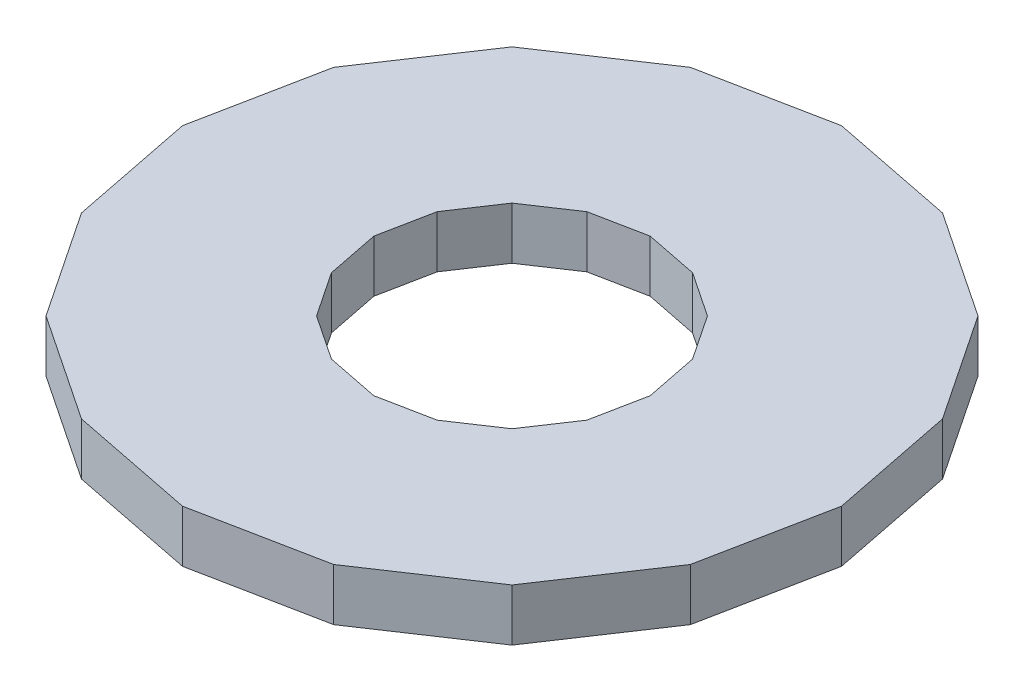
ISO-10303-21;
HEADER;
FILE_DESCRIPTION(('STEP AP214'),'2;1');
FILE_NAME('part.step','',(''),(''),'','','');
FILE_SCHEMA(('AUTOMOTIVE_DESIGN { 1 0 10303 214 1 1 1 1 }'));
ENDSEC;
DATA;
#1=APPLICATION_CONTEXT('core data for automotive mechanical design processes');
#2=APPLICATION_PROTOCOL_DEFINITION('international standard','automotive_design',2000,#1);
#3=PRODUCT_CONTEXT('',#1,'mechanical');
#4=PRODUCT('Part','Part','',(#3));
#5=PRODUCT_RELATED_PRODUCT_CATEGORY('part','',(#4));
#6=PRODUCT_DEFINITION_FORMATION('','',#4);
#7=PRODUCT_DEFINITION_CONTEXT('part definition',#1,'design');
#8=PRODUCT_DEFINITION('design','',#6,#7);
#9=PRODUCT_DEFINITION_SHAPE('','',#8);
#10=(LENGTH_UNIT() NAMED_UNIT(*) SI_UNIT(.MILLI.,.METRE.));
#11=(NAMED_UNIT(*) PLANE_ANGLE_UNIT() SI_UNIT($,.RADIAN.));
#12=(NAMED_UNIT(*) SI_UNIT($,.STERADIAN.) SOLID_ANGLE_UNIT());
#13=UNCERTAINTY_MEASURE_WITH_UNIT(LENGTH_MEASURE(1.E-05),#10,'distance_accuracy_value','');
#14=(GEOMETRIC_REPRESENTATION_CONTEXT(3) GLOBAL_UNCERTAINTY_ASSIGNED_CONTEXT((#13)) GLOBAL_UNIT_ASSIGNED_CONTEXT((#10,
#11,#12)) REPRESENTATION_CONTEXT('',''));
#15=CARTESIAN_POINT('',(0.,0.,0.));
#16=DIRECTION('',(0.,0.,1.));
#17=DIRECTION('',(1.,0.,0.));
#18=AXIS2_PLACEMENT_3D('',#15,#16,#17);
#19=CARTESIAN_POINT('',(0.,19.05,0.));
#20=DIRECTION('',(0.,1.,0.));
#21=DIRECTION('',(0.,0.,1.));
#22=AXIS2_PLACEMENT_3D('',#19,#20,#21);
#23=PLANE('',#22);
#24=DIRECTION('',(0.195090322016117,0.,-0.980785280403233));
#25=VECTOR('',#24,1.);
#26=CARTESIAN_POINT('',(111.264102657836,19.05,46.0871003261466));
#27=LINE('',#26,#25);
#28=CARTESIAN_POINT('',(111.264102657836,19.05,46.0871003261466));
#29=VERTEX_POINT('',#28);
#30=CARTESIAN_POINT('',(120.431396889373,19.05,-1.34614549599888E-12));
#31=VERTEX_POINT('',#30);
#32=EDGE_CURVE('E385',#29,#31,#27,.T.);
#33=ORIENTED_EDGE('',*,*,#32,.T.);
#34=DIRECTION('',(-0.195090322016139,0.,-0.980785280403228));
#35=VECTOR('',#34,1.);
#36=CARTESIAN_POINT('',(120.431396889373,19.05,-1.34614549599888E-12));
#37=LINE('',#36,#35);
#38=CARTESIAN_POINT('',(111.264102657835,19.05,-46.0871003261491));
#39=VERTEX_POINT('',#38);
#40=EDGE_CURVE('E389',#31,#39,#37,.T.);
#41=ORIENTED_EDGE('',*,*,#40,.T.);
#42=DIRECTION('',(-0.555570233019612,0.,-0.831469612302539));
#43=VECTOR('',#42,1.);
#44=CARTESIAN_POINT('',(111.264102657835,19.05,-46.0871003261491));
#45=LINE('',#44,#43);
#46=CARTESIAN_POINT('',(85.1578574082435,19.05,-85.1578574082453));
#47=VERTEX_POINT('',#46);
#48=EDGE_CURVE('E393',#39,#47,#45,.T.);
#49=ORIENTED_EDGE('',*,*,#48,.T.);
#50=DIRECTION('',(-0.831469612302551,0.,-0.555570233019593));
#51=VECTOR('',#50,1.);
#52=CARTESIAN_POINT('',(85.1578574082435,19.05,-85.1578574082453));
#53=LINE('',#52,#51);
#54=CARTESIAN_POINT('',(46.0871003261468,19.05,-111.264102657836));
#55=VERTEX_POINT('',#54);
#56=EDGE_CURVE('E395',#47,#55,#53,.T.);
#57=ORIENTED_EDGE('',*,*,#56,.T.);
#58=DIRECTION('',(-0.980785280403233,0.,-0.195090322016117));
#59=VECTOR('',#58,1.);
#60=CARTESIAN_POINT('',(46.0871003261468,19.05,-111.264102657836));
#61=LINE('',#60,#59);
#62=CARTESIAN_POINT('',(-1.4224713131917E-12,19.05,-120.431396889373));
#63=VERTEX_POINT('',#62);
#64=EDGE_CURVE('E398',#55,#63,#61,.T.);
#65=ORIENTED_EDGE('',*,*,#64,.T.);
#66=DIRECTION('',(-0.980785280403228,0.,0.195090322016139));
#67=VECTOR('',#66,1.);
#68=CARTESIAN_POINT('',(-1.4224713131917E-12,19.05,-120.431396889373));
#69=LINE('',#68,#67);
#70=CARTESIAN_POINT('',(-46.087100326149,19.05,-111.264102657835));
#71=VERTEX_POINT('',#70);
#72=EDGE_CURVE('E400',#63,#71,#69,.T.);
#73=ORIENTED_EDGE('',*,*,#72,.T.);
#74=DIRECTION('',(-0.831469612302539,0.,0.555570233019612));
#75=VECTOR('',#74,1.);
#76=CARTESIAN_POINT('',(-46.087100326149,19.05,-111.264102657835));
#77=LINE('',#76,#75);
#78=CARTESIAN_POINT('',(-85.1578574082452,19.05,-85.1578574082433));
#79=VERTEX_POINT('',#78);
#80=EDGE_CURVE('E402',#71,#79,#77,.T.);
#81=ORIENTED_EDGE('',*,*,#80,.T.);
#82=DIRECTION('',(-0.555570233019593,0.,0.831469612302551));
#83=VECTOR('',#82,1.);
#84=CARTESIAN_POINT('',(-85.1578574082452,19.05,-85.1578574082433));
#85=LINE('',#84,#83);
#86=CARTESIAN_POINT('',(-111.264102657836,19.05,-46.0871003261465));
#87=VERTEX_POINT('',#86);
#88=EDGE_CURVE('E404',#79,#87,#85,.T.);
#89=ORIENTED_EDGE('',*,*,#88,.T.);
#90=DIRECTION('',(-0.195090322016117,0.,0.980785280403233));
#91=VECTOR('',#90,1.);
#92=CARTESIAN_POINT('',(-111.264102657836,19.05,-46.0871003261465));
#93=LINE('',#92,#91);
#94=CARTESIAN_POINT('',(-120.431396889373,19.05,1.36002247140415E-12));
#95=VERTEX_POINT('',#94);
#96=EDGE_CURVE('E406',#87,#95,#93,.T.);
#97=ORIENTED_EDGE('',*,*,#96,.T.);
#98=DIRECTION('',(0.195090322016139,0.,0.980785280403228));
#99=VECTOR('',#98,1.);
#100=CARTESIAN_POINT('',(-120.431396889373,19.05,1.36002247140415E-12));
#101=LINE('',#100,#99);
#102=CARTESIAN_POINT('',(-111.264102657835,19.05,46.087100326149));
#103=VERTEX_POINT('',#102);
#104=EDGE_CURVE('E409',#95,#103,#101,.T.);
#105=ORIENTED_EDGE('',*,*,#104,.T.);
#106=DIRECTION('',(0.555570233019611,0.,0.831469612302539));
#107=VECTOR('',#106,1.);
#108=CARTESIAN_POINT('',(-111.264102657835,19.05,46.087100326149));
#109=LINE('',#108,#107);
#110=CARTESIAN_POINT('',(-85.1578574082434,19.05,85.1578574082453));
#111=VERTEX_POINT('',#110);
#112=EDGE_CURVE('E411',#103,#111,#109,.T.);
#113=ORIENTED_EDGE('',*,*,#112,.T.);
#114=DIRECTION('',(0.831469612302551,0.,0.555570233019593));
#115=VECTOR('',#114,1.);
#116=CARTESIAN_POINT('',(-85.1578574082434,19.05,85.1578574082453));
#117=LINE('',#116,#115);
#118=CARTESIAN_POINT('',(-46.0871003261465,19.05,111.264102657836));
#119=VERTEX_POINT('',#118);
#120=EDGE_CURVE('E413',#111,#119,#117,.T.);
#121=ORIENTED_EDGE('',*,*,#120,.T.);
#122=DIRECTION('',(0.980785280403233,0.,0.195090322016118));
#123=VECTOR('',#122,1.);
#124=CARTESIAN_POINT('',(-46.0871003261465,19.05,111.264102657836));
#125=LINE('',#124,#123);
#126=CARTESIAN_POINT('',(1.33192594686061E-12,19.05,120.431396889373));
#127=VERTEX_POINT('',#126);
#128=EDGE_CURVE('E415',#119,#127,#125,.T.);
#129=ORIENTED_EDGE('',*,*,#128,.T.);
#130=DIRECTION('',(0.980785280403228,0.,-0.195090322016139));
#131=VECTOR('',#130,1.);
#132=CARTESIAN_POINT('',(1.33192594686061E-12,19.05,120.431396889373));
#133=LINE('',#132,#131);
#134=CARTESIAN_POINT('',(46.087100326149,19.05,111.264102657835));
#135=VERTEX_POINT('',#134);
#136=EDGE_CURVE('E417',#127,#135,#133,.T.);
#137=ORIENTED_EDGE('',*,*,#136,.T.);
#138=DIRECTION('',(0.831469612302539,0.,-0.555570233019612));
#139=VECTOR('',#138,1.);
#140=CARTESIAN_POINT('',(46.087100326149,19.05,111.264102657835));
#141=LINE('',#140,#139);
#142=CARTESIAN_POINT('',(85.1578574082453,19.05,85.1578574082434));
#143=VERTEX_POINT('',#142);
#144=EDGE_CURVE('E420',#135,#143,#141,.T.);
#145=ORIENTED_EDGE('',*,*,#144,.T.);
#146=DIRECTION('',(0.555570233019593,0.,-0.831469612302551));
#147=VECTOR('',#146,1.);
#148=CARTESIAN_POINT('',(85.1578574082453,19.05,85.1578574082434));
#149=LINE('',#148,#147);
#150=EDGE_CURVE('E422',#143,#29,#149,.T.);
#151=ORIENTED_EDGE('',*,*,#150,.T.);
#152=EDGE_LOOP('',(#33,#41,#49,#57,#65,#73,#81,#89,#97,#105,#113,#121,#129,#137,#145,#151));
#153=FACE_BOUND('',#152,.T.);
#154=DIRECTION('',(-0.195090322016139,0.,-0.980785280403228));
#155=VECTOR('',#154,1.);
#156=CARTESIAN_POINT('',(50.5078352594468,19.05,-5.82868249841986E-13));
#157=LINE('',#156,#155);
#158=CARTESIAN_POINT('',(50.5078352594468,19.05,-5.82868249841986E-13));
#159=VERTEX_POINT('',#158);
#160=CARTESIAN_POINT('',(46.6631552276546,19.05,-19.3285117584162));
#161=VERTEX_POINT('',#160);
#162=EDGE_CURVE('E252',#159,#161,#157,.T.);
#163=ORIENTED_EDGE('',*,*,#162,.F.);
#164=DIRECTION('',(0.195090322016117,0.,-0.980785280403233));
#165=VECTOR('',#164,1.);
#166=CARTESIAN_POINT('',(46.663155227655,19.05,19.3285117584151));
#167=LINE('',#166,#165);
#168=CARTESIAN_POINT('',(46.663155227655,19.05,19.3285117584151));
#169=VERTEX_POINT('',#168);
#170=EDGE_CURVE('E243',#169,#159,#167,.T.);
#171=ORIENTED_EDGE('',*,*,#170,.F.);
#172=DIRECTION('',(0.555570233019593,0.,-0.831469612302552));
#173=VECTOR('',#172,1.);
#174=CARTESIAN_POINT('',(35.7144328150083,19.05,35.7144328150075));
#175=LINE('',#174,#173);
#176=CARTESIAN_POINT('',(35.7144328150083,19.05,35.7144328150075));
#177=VERTEX_POINT('',#176);
#178=EDGE_CURVE('E299',#177,#169,#175,.T.);
#179=ORIENTED_EDGE('',*,*,#178,.F.);
#180=DIRECTION('',(0.831469612302539,0.,-0.555570233019612));
#181=VECTOR('',#180,1.);
#182=CARTESIAN_POINT('',(19.3285117584162,19.05,46.6631552276546));
#183=LINE('',#182,#181);
#184=CARTESIAN_POINT('',(19.3285117584162,19.05,46.6631552276546));
#185=VERTEX_POINT('',#184);
#186=EDGE_CURVE('E296',#185,#177,#183,.T.);
#187=ORIENTED_EDGE('',*,*,#186,.F.);
#188=DIRECTION('',(0.980785280403228,0.,-0.195090322016139));
#189=VECTOR('',#188,1.);
#190=CARTESIAN_POINT('',(5.32130748839017E-13,19.05,50.5078352594468));
#191=LINE('',#190,#189);
#192=CARTESIAN_POINT('',(5.32130748839017E-13,19.05,50.5078352594468));
#193=VERTEX_POINT('',#192);
#194=EDGE_CURVE('E293',#193,#185,#191,.T.);
#195=ORIENTED_EDGE('',*,*,#194,.F.);
#196=DIRECTION('',(0.980785280403233,0.,0.195090322016118));
#197=VECTOR('',#196,1.);
#198=CARTESIAN_POINT('',(-19.3285117584151,19.05,46.6631552276551));
#199=LINE('',#198,#197);
#200=CARTESIAN_POINT('',(-19.3285117584151,19.05,46.6631552276551));
#201=VERTEX_POINT('',#200);
#202=EDGE_CURVE('E291',#201,#193,#199,.T.);
#203=ORIENTED_EDGE('',*,*,#202,.F.);
#204=DIRECTION('',(0.831469612302551,0.,0.555570233019593));
#205=VECTOR('',#204,1.);
#206=CARTESIAN_POINT('',(-35.7144328150075,19.05,35.7144328150083));
#207=LINE('',#206,#205);
#208=CARTESIAN_POINT('',(-35.7144328150075,19.05,35.7144328150083));
#209=VERTEX_POINT('',#208);
#210=EDGE_CURVE('E288',#209,#201,#207,.T.);
#211=ORIENTED_EDGE('',*,*,#210,.F.);
#212=DIRECTION('',(0.555570233019611,0.,0.831469612302539));
#213=VECTOR('',#212,1.);
#214=CARTESIAN_POINT('',(-46.6631552276546,19.05,19.3285117584161));
#215=LINE('',#214,#213);
#216=CARTESIAN_POINT('',(-46.6631552276546,19.05,19.3285117584161));
#217=VERTEX_POINT('',#216);
#218=EDGE_CURVE('E286',#217,#209,#215,.T.);
#219=ORIENTED_EDGE('',*,*,#218,.F.);
#220=DIRECTION('',(0.195090322016139,0.,0.980785280403228));
#221=VECTOR('',#220,1.);
#222=CARTESIAN_POINT('',(-50.5078352594468,19.05,5.3776812480437E-13));
#223=LINE('',#222,#221);
#224=CARTESIAN_POINT('',(-50.5078352594468,19.05,5.3776812480437E-13));
#225=VERTEX_POINT('',#224);
#226=EDGE_CURVE('E283',#225,#217,#223,.T.);
#227=ORIENTED_EDGE('',*,*,#226,.F.);
#228=DIRECTION('',(-0.195090322016117,0.,0.980785280403233));
#229=VECTOR('',#228,1.);
#230=CARTESIAN_POINT('',(-46.6631552276551,19.05,-19.3285117584151));
#231=LINE('',#230,#229);
#232=CARTESIAN_POINT('',(-46.6631552276551,19.05,-19.3285117584151));
#233=VERTEX_POINT('',#232);
#234=EDGE_CURVE('E281',#233,#225,#231,.T.);
#235=ORIENTED_EDGE('',*,*,#234,.F.);
#236=DIRECTION('',(-0.555570233019593,0.,0.831469612302551));
#237=VECTOR('',#236,1.);
#238=CARTESIAN_POINT('',(-35.7144328150083,19.05,-35.7144328150074));
#239=LINE('',#238,#237);
#240=CARTESIAN_POINT('',(-35.7144328150083,19.05,-35.7144328150074));
#241=VERTEX_POINT('',#240);
#242=EDGE_CURVE('E279',#241,#233,#239,.T.);
#243=ORIENTED_EDGE('',*,*,#242,.F.);
#244=DIRECTION('',(-0.831469612302539,0.,0.555570233019612));
#245=VECTOR('',#244,1.);
#246=CARTESIAN_POINT('',(-19.3285117584161,19.05,-46.6631552276546));
#247=LINE('',#246,#245);
#248=CARTESIAN_POINT('',(-19.3285117584161,19.05,-46.6631552276546));
#249=VERTEX_POINT('',#248);
#250=EDGE_CURVE('E276',#249,#241,#247,.T.);
#251=ORIENTED_EDGE('',*,*,#250,.F.);
#252=DIRECTION('',(-0.980785280403228,0.,0.195090322016139));
#253=VECTOR('',#252,1.);
#254=CARTESIAN_POINT('',(-5.65525179981748E-13,19.05,-50.5078352594468));
#255=LINE('',#254,#253);
#256=CARTESIAN_POINT('',(-5.65525179981748E-13,19.05,-50.5078352594468));
#257=VERTEX_POINT('',#256);
#258=EDGE_CURVE('E274',#257,#249,#255,.T.);
#259=ORIENTED_EDGE('',*,*,#258,.F.);
#260=DIRECTION('',(-0.980785280403233,0.,-0.195090322016117));
#261=VECTOR('',#260,1.);
#262=CARTESIAN_POINT('',(19.3285117584151,19.05,-46.663155227655));
#263=LINE('',#262,#261);
#264=CARTESIAN_POINT('',(19.3285117584151,19.05,-46.663155227655));
#265=VERTEX_POINT('',#264);
#266=EDGE_CURVE('E272',#265,#257,#263,.T.);
#267=ORIENTED_EDGE('',*,*,#266,.F.);
#268=DIRECTION('',(-0.831469612302552,0.,-0.555570233019593));
#269=VECTOR('',#268,1.);
#270=CARTESIAN_POINT('',(35.7144328150075,19.05,-35.7144328150082));
#271=LINE('',#270,#269);
#272=CARTESIAN_POINT('',(35.7144328150075,19.05,-35.7144328150082));
#273=VERTEX_POINT('',#272);
#274=EDGE_CURVE('E268',#273,#265,#271,.T.);
#275=ORIENTED_EDGE('',*,*,#274,.F.);
#276=DIRECTION('',(-0.555570233019612,0.,-0.831469612302539));
#277=VECTOR('',#276,1.);
#278=CARTESIAN_POINT('',(46.6631552276546,19.05,-19.3285117584162));
#279=LINE('',#278,#277);
#280=EDGE_CURVE('E266',#161,#273,#279,.T.);
#281=ORIENTED_EDGE('',*,*,#280,.F.);
#282=EDGE_LOOP('',(#163,#171,#179,#187,#195,#203,#211,#219,#227,#235,#243,#251,#259,#267,#275,#281));
#283=FACE_BOUND('',#282,.T.);
#284=ADVANCED_FACE('F34',(#153,#283),#23,.T.);
#285=CARTESIAN_POINT('',(0.,0.,0.));
#286=DIRECTION('',(0.,1.,0.));
#287=DIRECTION('',(0.,0.,1.));
#288=AXIS2_PLACEMENT_3D('',#285,#286,#287);
#289=PLANE('',#288);
#290=DIRECTION('',(0.195090322016117,0.,-0.980785280403233));
#291=VECTOR('',#290,1.);
#292=CARTESIAN_POINT('',(111.264102657836,0.,46.0871003261466));
#293=LINE('',#292,#291);
#294=CARTESIAN_POINT('',(111.264102657836,0.,46.0871003261466));
#295=VERTEX_POINT('',#294);
#296=CARTESIAN_POINT('',(120.431396889373,0.,-1.34614549599888E-12));
#297=VERTEX_POINT('',#296);
#298=EDGE_CURVE('E261',#295,#297,#293,.T.);
#299=ORIENTED_EDGE('',*,*,#298,.F.);
#300=DIRECTION('',(0.555570233019593,0.,-0.831469612302551));
#301=VECTOR('',#300,1.);
#302=CARTESIAN_POINT('',(85.1578574082453,0.,85.1578574082434));
#303=LINE('',#302,#301);
#304=CARTESIAN_POINT('',(85.1578574082453,0.,85.1578574082434));
#305=VERTEX_POINT('',#304);
#306=EDGE_CURVE('E390',#305,#295,#303,.T.);
#307=ORIENTED_EDGE('',*,*,#306,.F.);
#308=DIRECTION('',(0.831469612302539,0.,-0.555570233019612));
#309=VECTOR('',#308,1.);
#310=CARTESIAN_POINT('',(46.087100326149,0.,111.264102657835));
#311=LINE('',#310,#309);
#312=CARTESIAN_POINT('',(46.087100326149,0.,111.264102657835));
#313=VERTEX_POINT('',#312);
#314=EDGE_CURVE('E455',#313,#305,#311,.T.);
#315=ORIENTED_EDGE('',*,*,#314,.F.);
#316=DIRECTION('',(0.980785280403228,0.,-0.195090322016139));
#317=VECTOR('',#316,1.);
#318=CARTESIAN_POINT('',(1.33192594686061E-12,0.,120.431396889373));
#319=LINE('',#318,#317);
#320=CARTESIAN_POINT('',(1.33192594686061E-12,0.,120.431396889373));
#321=VERTEX_POINT('',#320);
#322=EDGE_CURVE('E453',#321,#313,#319,.T.);
#323=ORIENTED_EDGE('',*,*,#322,.F.);
#324=DIRECTION('',(0.980785280403233,0.,0.195090322016118));
#325=VECTOR('',#324,1.);
#326=CARTESIAN_POINT('',(-46.0871003261465,0.,111.264102657836));
#327=LINE('',#326,#325);
#328=CARTESIAN_POINT('',(-46.0871003261465,0.,111.264102657836));
#329=VERTEX_POINT('',#328);
#330=EDGE_CURVE('E451',#329,#321,#327,.T.);
#331=ORIENTED_EDGE('',*,*,#330,.F.);
#332=DIRECTION('',(0.831469612302551,0.,0.555570233019593));
#333=VECTOR('',#332,1.);
#334=CARTESIAN_POINT('',(-85.1578574082434,0.,85.1578574082453));
#335=LINE('',#334,#333);
#336=CARTESIAN_POINT('',(-85.1578574082434,0.,85.1578574082453));
#337=VERTEX_POINT('',#336);
#338=EDGE_CURVE('E449',#337,#329,#335,.T.);
#339=ORIENTED_EDGE('',*,*,#338,.F.);
#340=DIRECTION('',(0.555570233019611,0.,0.831469612302539));
#341=VECTOR('',#340,1.);
#342=CARTESIAN_POINT('',(-111.264102657835,0.,46.087100326149));
#343=LINE('',#342,#341);
#344=CARTESIAN_POINT('',(-111.264102657835,0.,46.087100326149));
#345=VERTEX_POINT('',#344);
#346=EDGE_CURVE('E447',#345,#337,#343,.T.);
#347=ORIENTED_EDGE('',*,*,#346,.F.);
#348=DIRECTION('',(0.195090322016139,0.,0.980785280403228));
#349=VECTOR('',#348,1.);
#350=CARTESIAN_POINT('',(-120.431396889373,0.,1.36002247140415E-12));
#351=LINE('',#350,#349);
#352=CARTESIAN_POINT('',(-120.431396889373,0.,1.36002247140415E-12));
#353=VERTEX_POINT('',#352);
#354=EDGE_CURVE('E445',#353,#345,#351,.T.);
#355=ORIENTED_EDGE('',*,*,#354,.F.);
#356=DIRECTION('',(-0.195090322016117,0.,0.980785280403233));
#357=VECTOR('',#356,1.);
#358=CARTESIAN_POINT('',(-111.264102657836,0.,-46.0871003261465));
#359=LINE('',#358,#357);
#360=CARTESIAN_POINT('',(-111.264102657836,0.,-46.0871003261465));
#361=VERTEX_POINT('',#360);
#362=EDGE_CURVE('E443',#361,#353,#359,.T.);
#363=ORIENTED_EDGE('',*,*,#362,.F.);
#364=DIRECTION('',(-0.555570233019593,0.,0.831469612302551));
#365=VECTOR('',#364,1.);
#366=CARTESIAN_POINT('',(-85.1578574082452,0.,-85.1578574082433));
#367=LINE('',#366,#365);
#368=CARTESIAN_POINT('',(-85.1578574082452,0.,-85.1578574082433));
#369=VERTEX_POINT('',#368);
#370=EDGE_CURVE('E441',#369,#361,#367,.T.);
#371=ORIENTED_EDGE('',*,*,#370,.F.);
#372=DIRECTION('',(-0.831469612302539,0.,0.555570233019612));
#373=VECTOR('',#372,1.);
#374=CARTESIAN_POINT('',(-46.087100326149,0.,-111.264102657835));
#375=LINE('',#374,#373);
#376=CARTESIAN_POINT('',(-46.087100326149,0.,-111.264102657835));
#377=VERTEX_POINT('',#376);
#378=EDGE_CURVE('E439',#377,#369,#375,.T.);
#379=ORIENTED_EDGE('',*,*,#378,.F.);
#380=DIRECTION('',(-0.980785280403228,0.,0.195090322016139));
#381=VECTOR('',#380,1.);
#382=CARTESIAN_POINT('',(-1.4224713131917E-12,0.,-120.431396889373));
#383=LINE('',#382,#381);
#384=CARTESIAN_POINT('',(-1.4224713131917E-12,0.,-120.431396889373));
#385=VERTEX_POINT('',#384);
#386=EDGE_CURVE('E437',#385,#377,#383,.T.);
#387=ORIENTED_EDGE('',*,*,#386,.F.);
#388=DIRECTION('',(-0.980785280403233,0.,-0.195090322016117));
#389=VECTOR('',#388,1.);
#390=CARTESIAN_POINT('',(46.0871003261468,0.,-111.264102657836));
#391=LINE('',#390,#389);
#392=CARTESIAN_POINT('',(46.0871003261468,0.,-111.264102657836));
#393=VERTEX_POINT('',#392);
#394=EDGE_CURVE('E435',#393,#385,#391,.T.);
#395=ORIENTED_EDGE('',*,*,#394,.F.);
#396=DIRECTION('',(-0.831469612302551,0.,-0.555570233019593));
#397=VECTOR('',#396,1.);
#398=CARTESIAN_POINT('',(85.1578574082435,0.,-85.1578574082453));
#399=LINE('',#398,#397);
#400=CARTESIAN_POINT('',(85.1578574082435,0.,-85.1578574082453));
#401=VERTEX_POINT('',#400);
#402=EDGE_CURVE('E433',#401,#393,#399,.T.);
#403=ORIENTED_EDGE('',*,*,#402,.F.);
#404=DIRECTION('',(-0.555570233019612,0.,-0.831469612302539));
#405=VECTOR('',#404,1.);
#406=CARTESIAN_POINT('',(111.264102657835,0.,-46.0871003261491));
#407=LINE('',#406,#405);
#408=CARTESIAN_POINT('',(111.264102657835,0.,-46.0871003261491));
#409=VERTEX_POINT('',#408);
#410=EDGE_CURVE('E431',#409,#401,#407,.T.);
#411=ORIENTED_EDGE('',*,*,#410,.F.);
#412=DIRECTION('',(-0.195090322016139,0.,-0.980785280403228));
#413=VECTOR('',#412,1.);
#414=CARTESIAN_POINT('',(120.431396889373,0.,-1.34614549599888E-12));
#415=LINE('',#414,#413);
#416=EDGE_CURVE('E428',#297,#409,#415,.T.);
#417=ORIENTED_EDGE('',*,*,#416,.F.);
#418=EDGE_LOOP('',(#299,#307,#315,#323,#331,#339,#347,#355,#363,#371,#379,#387,#395,#403,#411,#417));
#419=FACE_BOUND('',#418,.T.);
#420=DIRECTION('',(0.195090322016117,0.,-0.980785280403233));
#421=VECTOR('',#420,1.);
#422=CARTESIAN_POINT('',(46.663155227655,0.,19.3285117584151));
#423=LINE('',#422,#421);
#424=CARTESIAN_POINT('',(46.663155227655,0.,19.3285117584151));
#425=VERTEX_POINT('',#424);
#426=CARTESIAN_POINT('',(50.5078352594468,0.,-5.82868249841986E-13));
#427=VERTEX_POINT('',#426);
#428=EDGE_CURVE('E57',#425,#427,#423,.T.);
#429=ORIENTED_EDGE('',*,*,#428,.T.);
#430=DIRECTION('',(-0.195090322016139,0.,-0.980785280403228));
#431=VECTOR('',#430,1.);
#432=CARTESIAN_POINT('',(50.5078352594468,0.,-5.82868249841986E-13));
#433=LINE('',#432,#431);
#434=CARTESIAN_POINT('',(46.6631552276546,0.,-19.3285117584162));
#435=VERTEX_POINT('',#434);
#436=EDGE_CURVE('E259',#427,#435,#433,.T.);
#437=ORIENTED_EDGE('',*,*,#436,.T.);
#438=DIRECTION('',(-0.555570233019612,0.,-0.831469612302539));
#439=VECTOR('',#438,1.);
#440=CARTESIAN_POINT('',(46.6631552276546,0.,-19.3285117584162));
#441=LINE('',#440,#439);
#442=CARTESIAN_POINT('',(35.7144328150075,0.,-35.7144328150082));
#443=VERTEX_POINT('',#442);
#444=EDGE_CURVE('E304',#435,#443,#441,.T.);
#445=ORIENTED_EDGE('',*,*,#444,.T.);
#446=DIRECTION('',(-0.831469612302552,0.,-0.555570233019593));
#447=VECTOR('',#446,1.);
#448=CARTESIAN_POINT('',(35.7144328150075,0.,-35.7144328150082));
#449=LINE('',#448,#447);
#450=CARTESIAN_POINT('',(19.3285117584151,0.,-46.663155227655));
#451=VERTEX_POINT('',#450);
#452=EDGE_CURVE('E308',#443,#451,#449,.T.);
#453=ORIENTED_EDGE('',*,*,#452,.T.);
#454=DIRECTION('',(-0.980785280403233,0.,-0.195090322016117));
#455=VECTOR('',#454,1.);
#456=CARTESIAN_POINT('',(19.3285117584151,0.,-46.663155227655));
#457=LINE('',#456,#455);
#458=CARTESIAN_POINT('',(-5.65525179981748E-13,0.,-50.5078352594468));
#459=VERTEX_POINT('',#458);
#460=EDGE_CURVE('E311',#451,#459,#457,.T.);
#461=ORIENTED_EDGE('',*,*,#460,.T.);
#462=DIRECTION('',(-0.980785280403228,0.,0.195090322016139));
#463=VECTOR('',#462,1.);
#464=CARTESIAN_POINT('',(-5.65525179981748E-13,0.,-50.5078352594468));
#465=LINE('',#464,#463);
#466=CARTESIAN_POINT('',(-19.3285117584161,0.,-46.6631552276546));
#467=VERTEX_POINT('',#466);
#468=EDGE_CURVE('E314',#459,#467,#465,.T.);
#469=ORIENTED_EDGE('',*,*,#468,.T.);
#470=DIRECTION('',(-0.831469612302539,0.,0.555570233019612));
#471=VECTOR('',#470,1.);
#472=CARTESIAN_POINT('',(-19.3285117584161,0.,-46.6631552276546));
#473=LINE('',#472,#471);
#474=CARTESIAN_POINT('',(-35.7144328150083,0.,-35.7144328150074));
#475=VERTEX_POINT('',#474);
#476=EDGE_CURVE('E317',#467,#475,#473,.T.);
#477=ORIENTED_EDGE('',*,*,#476,.T.);
#478=DIRECTION('',(-0.555570233019593,0.,0.831469612302551));
#479=VECTOR('',#478,1.);
#480=CARTESIAN_POINT('',(-35.7144328150083,0.,-35.7144328150074));
#481=LINE('',#480,#479);
#482=CARTESIAN_POINT('',(-46.6631552276551,0.,-19.3285117584151));
#483=VERTEX_POINT('',#482);
#484=EDGE_CURVE('E321',#475,#483,#481,.T.);
#485=ORIENTED_EDGE('',*,*,#484,.T.);
#486=DIRECTION('',(-0.195090322016117,0.,0.980785280403233));
#487=VECTOR('',#486,1.);
#488=CARTESIAN_POINT('',(-46.6631552276551,0.,-19.3285117584151));
#489=LINE('',#488,#487);
#490=CARTESIAN_POINT('',(-50.5078352594468,0.,5.3776812480437E-13));
#491=VERTEX_POINT('',#490);
#492=EDGE_CURVE('E324',#483,#491,#489,.T.);
#493=ORIENTED_EDGE('',*,*,#492,.T.);
#494=DIRECTION('',(0.195090322016139,0.,0.980785280403228));
#495=VECTOR('',#494,1.);
#496=CARTESIAN_POINT('',(-50.5078352594468,0.,5.3776812480437E-13));
#497=LINE('',#496,#495);
#498=CARTESIAN_POINT('',(-46.6631552276546,0.,19.3285117584161));
#499=VERTEX_POINT('',#498);
#500=EDGE_CURVE('E328',#491,#499,#497,.T.);
#501=ORIENTED_EDGE('',*,*,#500,.T.);
#502=DIRECTION('',(0.555570233019611,0.,0.831469612302539));
#503=VECTOR('',#502,1.);
#504=CARTESIAN_POINT('',(-46.6631552276546,0.,19.3285117584161));
#505=LINE('',#504,#503);
#506=CARTESIAN_POINT('',(-35.7144328150075,0.,35.7144328150083));
#507=VERTEX_POINT('',#506);
#508=EDGE_CURVE('E331',#499,#507,#505,.T.);
#509=ORIENTED_EDGE('',*,*,#508,.T.);
#510=DIRECTION('',(0.831469612302551,0.,0.555570233019593));
#511=VECTOR('',#510,1.);
#512=CARTESIAN_POINT('',(-35.7144328150075,0.,35.7144328150083));
#513=LINE('',#512,#511);
#514=CARTESIAN_POINT('',(-19.3285117584151,0.,46.6631552276551));
#515=VERTEX_POINT('',#514);
#516=EDGE_CURVE('E334',#507,#515,#513,.T.);
#517=ORIENTED_EDGE('',*,*,#516,.T.);
#518=DIRECTION('',(0.980785280403233,0.,0.195090322016118));
#519=VECTOR('',#518,1.);
#520=CARTESIAN_POINT('',(-19.3285117584151,0.,46.6631552276551));
#521=LINE('',#520,#519);
#522=CARTESIAN_POINT('',(5.32130748839017E-13,0.,50.5078352594468));
#523=VERTEX_POINT('',#522);
#524=EDGE_CURVE('E338',#515,#523,#521,.T.);
#525=ORIENTED_EDGE('',*,*,#524,.T.);
#526=DIRECTION('',(0.980785280403228,0.,-0.195090322016139));
#527=VECTOR('',#526,1.);
#528=CARTESIAN_POINT('',(5.32130748839017E-13,0.,50.5078352594468));
#529=LINE('',#528,#527);
#530=CARTESIAN_POINT('',(19.3285117584162,0.,46.6631552276546));
#531=VERTEX_POINT('',#530);
#532=EDGE_CURVE('E342',#523,#531,#529,.T.);
#533=ORIENTED_EDGE('',*,*,#532,.T.);
#534=DIRECTION('',(0.831469612302539,0.,-0.555570233019612));
#535=VECTOR('',#534,1.);
#536=CARTESIAN_POINT('',(19.3285117584162,0.,46.6631552276546));
#537=LINE('',#536,#535);
#538=CARTESIAN_POINT('',(35.7144328150083,0.,35.7144328150075));
#539=VERTEX_POINT('',#538);
#540=EDGE_CURVE('E346',#531,#539,#537,.T.);
#541=ORIENTED_EDGE('',*,*,#540,.T.);
#542=DIRECTION('',(0.555570233019593,0.,-0.831469612302552));
#543=VECTOR('',#542,1.);
#544=CARTESIAN_POINT('',(35.7144328150083,0.,35.7144328150075));
#545=LINE('',#544,#543);
#546=EDGE_CURVE('E253',#539,#425,#545,.T.);
#547=ORIENTED_EDGE('',*,*,#546,.T.);
#548=EDGE_LOOP('',(#429,#437,#445,#453,#461,#469,#477,#485,#493,#501,#509,#517,#525,#533,#541,#547));
#549=FACE_BOUND('',#548,.T.);
#550=ADVANCED_FACE('F512',(#419,#549),#289,.F.);
#551=CARTESIAN_POINT('',(111.264102657836,19.05,46.0871003261466));
#552=DIRECTION('',(-0.980785280403233,0.,-0.195090322016117));
#553=DIRECTION('',(-0.195090322016117,0.,0.980785280403233));
#554=AXIS2_PLACEMENT_3D('',#551,#552,#553);
#555=PLANE('',#554);
#556=ORIENTED_EDGE('',*,*,#298,.T.);
#557=DIRECTION('',(0.,-1.,0.));
#558=VECTOR('',#557,1.);
#559=CARTESIAN_POINT('',(120.431396889373,19.05,-1.34614549599888E-12));
#560=LINE('',#559,#558);
#561=EDGE_CURVE('E11',#31,#297,#560,.T.);
#562=ORIENTED_EDGE('',*,*,#561,.F.);
#563=ORIENTED_EDGE('',*,*,#32,.F.);
#564=DIRECTION('',(0.,-1.,0.));
#565=VECTOR('',#564,1.);
#566=CARTESIAN_POINT('',(111.264102657836,19.05,46.0871003261466));
#567=LINE('',#566,#565);
#568=EDGE_CURVE('E424',#29,#295,#567,.T.);
#569=ORIENTED_EDGE('',*,*,#568,.T.);
#570=EDGE_LOOP('',(#556,#562,#563,#569));
#571=FACE_BOUND('',#570,.T.);
#572=ADVANCED_FACE('F36',(#571),#555,.F.);
#573=CARTESIAN_POINT('',(120.431396889373,19.05,-1.34614549599888E-12));
#574=DIRECTION('',(-0.980785280403228,0.,0.195090322016139));
#575=DIRECTION('',(0.195090322016139,0.,0.980785280403229));
#576=AXIS2_PLACEMENT_3D('',#573,#574,#575);
#577=PLANE('',#576);
#578=ORIENTED_EDGE('',*,*,#416,.T.);
#579=DIRECTION('',(0.,-1.,0.));
#580=VECTOR('',#579,1.);
#581=CARTESIAN_POINT('',(111.264102657835,19.05,-46.0871003261491));
#582=LINE('',#581,#580);
#583=EDGE_CURVE('E42',#39,#409,#582,.T.);
#584=ORIENTED_EDGE('',*,*,#583,.F.);
#585=ORIENTED_EDGE('',*,*,#40,.F.);
#586=ORIENTED_EDGE('',*,*,#561,.T.);
#587=EDGE_LOOP('',(#578,#584,#585,#586));
#588=FACE_BOUND('',#587,.T.);
#589=ADVANCED_FACE('F529',(#588),#577,.F.);
#590=CARTESIAN_POINT('',(111.264102657835,19.05,-46.0871003261491));
#591=DIRECTION('',(-0.831469612302539,0.,0.555570233019612));
#592=DIRECTION('',(0.555570233019612,0.,0.831469612302539));
#593=AXIS2_PLACEMENT_3D('',#590,#591,#592);
#594=PLANE('',#593);
#595=ORIENTED_EDGE('',*,*,#410,.T.);
#596=DIRECTION('',(0.,-1.,0.));
#597=VECTOR('',#596,1.);
#598=CARTESIAN_POINT('',(85.1578574082435,19.05,-85.1578574082453));
#599=LINE('',#598,#597);
#600=EDGE_CURVE('E498',#47,#401,#599,.T.);
#601=ORIENTED_EDGE('',*,*,#600,.F.);
#602=ORIENTED_EDGE('',*,*,#48,.F.);
#603=ORIENTED_EDGE('',*,*,#583,.T.);
#604=EDGE_LOOP('',(#595,#601,#602,#603));
#605=FACE_BOUND('',#604,.T.);
#606=ADVANCED_FACE('F506',(#605),#594,.F.);
#607=CARTESIAN_POINT('',(85.1578574082435,19.05,-85.1578574082453));
#608=DIRECTION('',(-0.555570233019593,0.,0.831469612302551));
#609=DIRECTION('',(0.831469612302551,0.,0.555570233019593));
#610=AXIS2_PLACEMENT_3D('',#607,#608,#609);
#611=PLANE('',#610);
#612=ORIENTED_EDGE('',*,*,#402,.T.);
#613=DIRECTION('',(0.,-1.,0.));
#614=VECTOR('',#613,1.);
#615=CARTESIAN_POINT('',(46.0871003261468,19.05,-111.264102657836));
#616=LINE('',#615,#614);
#617=EDGE_CURVE('E494',#55,#393,#616,.T.);
#618=ORIENTED_EDGE('',*,*,#617,.F.);
#619=ORIENTED_EDGE('',*,*,#56,.F.);
#620=ORIENTED_EDGE('',*,*,#600,.T.);
#621=EDGE_LOOP('',(#612,#618,#619,#620));
#622=FACE_BOUND('',#621,.T.);
#623=ADVANCED_FACE('F518',(#622),#611,.F.);
#624=CARTESIAN_POINT('',(46.0871003261468,19.05,-111.264102657836));
#625=DIRECTION('',(-0.195090322016117,0.,0.980785280403233));
#626=DIRECTION('',(0.980785280403233,0.,0.195090322016117));
#627=AXIS2_PLACEMENT_3D('',#624,#625,#626);
#628=PLANE('',#627);
#629=ORIENTED_EDGE('',*,*,#394,.T.);
#630=DIRECTION('',(0.,-1.,0.));
#631=VECTOR('',#630,1.);
#632=CARTESIAN_POINT('',(-1.4224713131917E-12,19.05,-120.431396889373));
#633=LINE('',#632,#631);
#634=EDGE_CURVE('E491',#63,#385,#633,.T.);
#635=ORIENTED_EDGE('',*,*,#634,.F.);
#636=ORIENTED_EDGE('',*,*,#64,.F.);
#637=ORIENTED_EDGE('',*,*,#617,.T.);
#638=EDGE_LOOP('',(#629,#635,#636,#637));
#639=FACE_BOUND('',#638,.T.);
#640=ADVANCED_FACE('F522',(#639),#628,.F.);
#641=CARTESIAN_POINT('',(-1.4224713131917E-12,19.05,-120.431396889373));
#642=DIRECTION('',(0.195090322016139,0.,0.980785280403228));
#643=DIRECTION('',(0.980785280403228,0.,-0.195090322016139));
#644=AXIS2_PLACEMENT_3D('',#641,#642,#643);
#645=PLANE('',#644);
#646=ORIENTED_EDGE('',*,*,#386,.T.);
#647=DIRECTION('',(0.,-1.,0.));
#648=VECTOR('',#647,1.);
#649=CARTESIAN_POINT('',(-46.087100326149,19.05,-111.264102657835));
#650=LINE('',#649,#648);
#651=EDGE_CURVE('E488',#71,#377,#650,.T.);
#652=ORIENTED_EDGE('',*,*,#651,.F.);
#653=ORIENTED_EDGE('',*,*,#72,.F.);
#654=ORIENTED_EDGE('',*,*,#634,.T.);
#655=EDGE_LOOP('',(#646,#652,#653,#654));
#656=FACE_BOUND('',#655,.T.);
#657=ADVANCED_FACE('F582',(#656),#645,.F.);
#658=CARTESIAN_POINT('',(-46.087100326149,19.05,-111.264102657835));
#659=DIRECTION('',(0.555570233019612,0.,0.831469612302539));
#660=DIRECTION('',(0.831469612302539,0.,-0.555570233019612));
#661=AXIS2_PLACEMENT_3D('',#658,#659,#660);
#662=PLANE('',#661);
#663=ORIENTED_EDGE('',*,*,#378,.T.);
#664=DIRECTION('',(0.,-1.,0.));
#665=VECTOR('',#664,1.);
#666=CARTESIAN_POINT('',(-85.1578574082452,19.05,-85.1578574082433));
#667=LINE('',#666,#665);
#668=EDGE_CURVE('E485',#79,#369,#667,.T.);
#669=ORIENTED_EDGE('',*,*,#668,.F.);
#670=ORIENTED_EDGE('',*,*,#80,.F.);
#671=ORIENTED_EDGE('',*,*,#651,.T.);
#672=EDGE_LOOP('',(#663,#669,#670,#671));
#673=FACE_BOUND('',#672,.T.);
#674=ADVANCED_FACE('F579',(#673),#662,.F.);
#675=CARTESIAN_POINT('',(-85.1578574082452,19.05,-85.1578574082433));
#676=DIRECTION('',(0.831469612302551,0.,0.555570233019593));
#677=DIRECTION('',(0.555570233019593,0.,-0.831469612302551));
#678=AXIS2_PLACEMENT_3D('',#675,#676,#677);
#679=PLANE('',#678);
#680=ORIENTED_EDGE('',*,*,#370,.T.);
#681=DIRECTION('',(0.,-1.,0.));
#682=VECTOR('',#681,1.);
#683=CARTESIAN_POINT('',(-111.264102657836,19.05,-46.0871003261465));
#684=LINE('',#683,#682);
#685=EDGE_CURVE('E482',#87,#361,#684,.T.);
#686=ORIENTED_EDGE('',*,*,#685,.F.);
#687=ORIENTED_EDGE('',*,*,#88,.F.);
#688=ORIENTED_EDGE('',*,*,#668,.T.);
#689=EDGE_LOOP('',(#680,#686,#687,#688));
#690=FACE_BOUND('',#689,.T.);
#691=ADVANCED_FACE('F575',(#690),#679,.F.);
#692=CARTESIAN_POINT('',(-111.264102657836,19.05,-46.0871003261465));
#693=DIRECTION('',(0.980785280403233,0.,0.195090322016117));
#694=DIRECTION('',(0.195090322016117,0.,-0.980785280403233));
#695=AXIS2_PLACEMENT_3D('',#692,#693,#694);
#696=PLANE('',#695);
#697=ORIENTED_EDGE('',*,*,#362,.T.);
#698=DIRECTION('',(0.,-1.,0.));
#699=VECTOR('',#698,1.);
#700=CARTESIAN_POINT('',(-120.431396889373,19.05,1.36002247140415E-12));
#701=LINE('',#700,#699);
#702=EDGE_CURVE('E479',#95,#353,#701,.T.);
#703=ORIENTED_EDGE('',*,*,#702,.F.);
#704=ORIENTED_EDGE('',*,*,#96,.F.);
#705=ORIENTED_EDGE('',*,*,#685,.T.);
#706=EDGE_LOOP('',(#697,#703,#704,#705));
#707=FACE_BOUND('',#706,.T.);
#708=ADVANCED_FACE('F571',(#707),#696,.F.);
#709=CARTESIAN_POINT('',(-120.431396889373,19.05,1.36002247140415E-12));
#710=DIRECTION('',(0.980785280403228,0.,-0.195090322016139));
#711=DIRECTION('',(-0.195090322016139,0.,-0.980785280403228));
#712=AXIS2_PLACEMENT_3D('',#709,#710,#711);
#713=PLANE('',#712);
#714=ORIENTED_EDGE('',*,*,#354,.T.);
#715=DIRECTION('',(0.,-1.,0.));
#716=VECTOR('',#715,1.);
#717=CARTESIAN_POINT('',(-111.264102657835,19.05,46.087100326149));
#718=LINE('',#717,#716);
#719=EDGE_CURVE('E476',#103,#345,#718,.T.);
#720=ORIENTED_EDGE('',*,*,#719,.F.);
#721=ORIENTED_EDGE('',*,*,#104,.F.);
#722=ORIENTED_EDGE('',*,*,#702,.T.);
#723=EDGE_LOOP('',(#714,#720,#721,#722));
#724=FACE_BOUND('',#723,.T.);
#725=ADVANCED_FACE('F566',(#724),#713,.F.);
#726=CARTESIAN_POINT('',(-111.264102657835,19.05,46.087100326149));
#727=DIRECTION('',(0.831469612302539,0.,-0.555570233019612));
#728=DIRECTION('',(-0.555570233019612,0.,-0.831469612302539));
#729=AXIS2_PLACEMENT_3D('',#726,#727,#728);
#730=PLANE('',#729);
#731=ORIENTED_EDGE('',*,*,#346,.T.);
#732=DIRECTION('',(0.,-1.,0.));
#733=VECTOR('',#732,1.);
#734=CARTESIAN_POINT('',(-85.1578574082434,19.05,85.1578574082453));
#735=LINE('',#734,#733);
#736=EDGE_CURVE('E473',#111,#337,#735,.T.);
#737=ORIENTED_EDGE('',*,*,#736,.F.);
#738=ORIENTED_EDGE('',*,*,#112,.F.);
#739=ORIENTED_EDGE('',*,*,#719,.T.);
#740=EDGE_LOOP('',(#731,#737,#738,#739));
#741=FACE_BOUND('',#740,.T.);
#742=ADVANCED_FACE('F560',(#741),#730,.F.);
#743=CARTESIAN_POINT('',(-85.1578574082434,19.05,85.1578574082453));
#744=DIRECTION('',(0.555570233019593,0.,-0.831469612302551));
#745=DIRECTION('',(-0.831469612302551,0.,-0.555570233019593));
#746=AXIS2_PLACEMENT_3D('',#743,#744,#745);
#747=PLANE('',#746);
#748=ORIENTED_EDGE('',*,*,#338,.T.);
#749=DIRECTION('',(0.,-1.,0.));
#750=VECTOR('',#749,1.);
#751=CARTESIAN_POINT('',(-46.0871003261465,19.05,111.264102657836));
#752=LINE('',#751,#750);
#753=EDGE_CURVE('E470',#119,#329,#752,.T.);
#754=ORIENTED_EDGE('',*,*,#753,.F.);
#755=ORIENTED_EDGE('',*,*,#120,.F.);
#756=ORIENTED_EDGE('',*,*,#736,.T.);
#757=EDGE_LOOP('',(#748,#754,#755,#756));
#758=FACE_BOUND('',#757,.T.);
#759=ADVANCED_FACE('F556',(#758),#747,.F.);
#760=CARTESIAN_POINT('',(-46.0871003261465,19.05,111.264102657836));
#761=DIRECTION('',(0.195090322016118,0.,-0.980785280403233));
#762=DIRECTION('',(-0.980785280403233,0.,-0.195090322016118));
#763=AXIS2_PLACEMENT_3D('',#760,#761,#762);
#764=PLANE('',#763);
#765=ORIENTED_EDGE('',*,*,#330,.T.);
#766=DIRECTION('',(0.,-1.,0.));
#767=VECTOR('',#766,1.);
#768=CARTESIAN_POINT('',(1.33192594686061E-12,19.05,120.431396889373));
#769=LINE('',#768,#767);
#770=EDGE_CURVE('E466',#127,#321,#769,.T.);
#771=ORIENTED_EDGE('',*,*,#770,.F.);
#772=ORIENTED_EDGE('',*,*,#128,.F.);
#773=ORIENTED_EDGE('',*,*,#753,.T.);
#774=EDGE_LOOP('',(#765,#771,#772,#773));
#775=FACE_BOUND('',#774,.T.);
#776=ADVANCED_FACE('F551',(#775),#764,.F.);
#777=CARTESIAN_POINT('',(1.33192594686061E-12,19.05,120.431396889373));
#778=DIRECTION('',(-0.195090322016139,0.,-0.980785280403228));
#779=DIRECTION('',(-0.980785280403229,0.,0.195090322016139));
#780=AXIS2_PLACEMENT_3D('',#777,#778,#779);
#781=PLANE('',#780);
#782=ORIENTED_EDGE('',*,*,#322,.T.);
#783=DIRECTION('',(0.,-1.,0.));
#784=VECTOR('',#783,1.);
#785=CARTESIAN_POINT('',(46.087100326149,19.05,111.264102657835));
#786=LINE('',#785,#784);
#787=EDGE_CURVE('E463',#135,#313,#786,.T.);
#788=ORIENTED_EDGE('',*,*,#787,.F.);
#789=ORIENTED_EDGE('',*,*,#136,.F.);
#790=ORIENTED_EDGE('',*,*,#770,.T.);
#791=EDGE_LOOP('',(#782,#788,#789,#790));
#792=FACE_BOUND('',#791,.T.);
#793=ADVANCED_FACE('F545',(#792),#781,.F.);
#794=CARTESIAN_POINT('',(46.087100326149,19.05,111.264102657835));
#795=DIRECTION('',(-0.555570233019612,0.,-0.831469612302539));
#796=DIRECTION('',(-0.831469612302539,0.,0.555570233019612));
#797=AXIS2_PLACEMENT_3D('',#794,#795,#796);
#798=PLANE('',#797);
#799=ORIENTED_EDGE('',*,*,#314,.T.);
#800=DIRECTION('',(0.,-1.,0.));
#801=VECTOR('',#800,1.);
#802=CARTESIAN_POINT('',(85.1578574082453,19.05,85.1578574082434));
#803=LINE('',#802,#801);
#804=EDGE_CURVE('E460',#143,#305,#803,.T.);
#805=ORIENTED_EDGE('',*,*,#804,.F.);
#806=ORIENTED_EDGE('',*,*,#144,.F.);
#807=ORIENTED_EDGE('',*,*,#787,.T.);
#808=EDGE_LOOP('',(#799,#805,#806,#807));
#809=FACE_BOUND('',#808,.T.);
#810=ADVANCED_FACE('F541',(#809),#798,.F.);
#811=CARTESIAN_POINT('',(85.1578574082453,19.05,85.1578574082434));
#812=DIRECTION('',(-0.831469612302551,0.,-0.555570233019593));
#813=DIRECTION('',(-0.555570233019593,0.,0.831469612302551));
#814=AXIS2_PLACEMENT_3D('',#811,#812,#813);
#815=PLANE('',#814);
#816=ORIENTED_EDGE('',*,*,#306,.T.);
#817=ORIENTED_EDGE('',*,*,#568,.F.);
#818=ORIENTED_EDGE('',*,*,#150,.F.);
#819=ORIENTED_EDGE('',*,*,#804,.T.);
#820=EDGE_LOOP('',(#816,#817,#818,#819));
#821=FACE_BOUND('',#820,.T.);
#822=ADVANCED_FACE('F536',(#821),#815,.F.);
#823=CARTESIAN_POINT('',(46.663155227655,19.05,19.3285117584151));
#824=DIRECTION('',(-0.980785280403233,0.,-0.195090322016117));
#825=DIRECTION('',(-0.195090322016117,0.,0.980785280403233));
#826=AXIS2_PLACEMENT_3D('',#823,#824,#825);
#827=PLANE('',#826);
#828=ORIENTED_EDGE('',*,*,#428,.F.);
#829=DIRECTION('',(0.,-1.,0.));
#830=VECTOR('',#829,1.);
#831=CARTESIAN_POINT('',(46.663155227655,19.05,19.3285117584151));
#832=LINE('',#831,#830);
#833=EDGE_CURVE('E247',#169,#425,#832,.T.);
#834=ORIENTED_EDGE('',*,*,#833,.F.);
#835=ORIENTED_EDGE('',*,*,#170,.T.);
#836=DIRECTION('',(0.,-1.,0.));
#837=VECTOR('',#836,1.);
#838=CARTESIAN_POINT('',(50.5078352594468,19.05,-5.82868249841986E-13));
#839=LINE('',#838,#837);
#840=EDGE_CURVE('E246',#159,#427,#839,.T.);
#841=ORIENTED_EDGE('',*,*,#840,.T.);
#842=EDGE_LOOP('',(#828,#834,#835,#841));
#843=FACE_BOUND('',#842,.T.);
#844=ADVANCED_FACE('F245',(#843),#827,.T.);
#845=CARTESIAN_POINT('',(50.5078352594468,19.05,-5.82868249841986E-13));
#846=DIRECTION('',(-0.980785280403228,0.,0.195090322016139));
#847=DIRECTION('',(0.195090322016139,0.,0.980785280403228));
#848=AXIS2_PLACEMENT_3D('',#845,#846,#847);
#849=PLANE('',#848);
#850=ORIENTED_EDGE('',*,*,#436,.F.);
#851=ORIENTED_EDGE('',*,*,#840,.F.);
#852=ORIENTED_EDGE('',*,*,#162,.T.);
#853=DIRECTION('',(0.,-1.,0.));
#854=VECTOR('',#853,1.);
#855=CARTESIAN_POINT('',(46.6631552276546,19.05,-19.3285117584162));
#856=LINE('',#855,#854);
#857=EDGE_CURVE('E262',#161,#435,#856,.T.);
#858=ORIENTED_EDGE('',*,*,#857,.T.);
#859=EDGE_LOOP('',(#850,#851,#852,#858));
#860=FACE_BOUND('',#859,.T.);
#861=ADVANCED_FACE('F256',(#860),#849,.T.);
#862=CARTESIAN_POINT('',(46.6631552276546,19.05,-19.3285117584162));
#863=DIRECTION('',(-0.831469612302539,0.,0.555570233019612));
#864=DIRECTION('',(0.555570233019612,0.,0.831469612302539));
#865=AXIS2_PLACEMENT_3D('',#862,#863,#864);
#866=PLANE('',#865);
#867=ORIENTED_EDGE('',*,*,#444,.F.);
#868=ORIENTED_EDGE('',*,*,#857,.F.);
#869=ORIENTED_EDGE('',*,*,#280,.T.);
#870=DIRECTION('',(0.,-1.,0.));
#871=VECTOR('',#870,1.);
#872=CARTESIAN_POINT('',(35.7144328150075,19.05,-35.7144328150082));
#873=LINE('',#872,#871);
#874=EDGE_CURVE('E381',#273,#443,#873,.T.);
#875=ORIENTED_EDGE('',*,*,#874,.T.);
#876=EDGE_LOOP('',(#867,#868,#869,#875));
#877=FACE_BOUND('',#876,.T.);
#878=ADVANCED_FACE('F664',(#877),#866,.T.);
#879=CARTESIAN_POINT('',(35.7144328150075,19.05,-35.7144328150082));
#880=DIRECTION('',(-0.555570233019593,0.,0.831469612302552));
#881=DIRECTION('',(0.831469612302552,0.,0.555570233019593));
#882=AXIS2_PLACEMENT_3D('',#879,#880,#881);
#883=PLANE('',#882);
#884=ORIENTED_EDGE('',*,*,#452,.F.);
#885=ORIENTED_EDGE('',*,*,#874,.F.);
#886=ORIENTED_EDGE('',*,*,#274,.T.);
#887=DIRECTION('',(0.,-1.,0.));
#888=VECTOR('',#887,1.);
#889=CARTESIAN_POINT('',(19.3285117584151,19.05,-46.663155227655));
#890=LINE('',#889,#888);
#891=EDGE_CURVE('E379',#265,#451,#890,.T.);
#892=ORIENTED_EDGE('',*,*,#891,.T.);
#893=EDGE_LOOP('',(#884,#885,#886,#892));
#894=FACE_BOUND('',#893,.T.);
#895=ADVANCED_FACE('F670',(#894),#883,.T.);
#896=CARTESIAN_POINT('',(19.3285117584151,19.05,-46.663155227655));
#897=DIRECTION('',(-0.195090322016117,0.,0.980785280403233));
#898=DIRECTION('',(0.980785280403233,0.,0.195090322016117));
#899=AXIS2_PLACEMENT_3D('',#896,#897,#898);
#900=PLANE('',#899);
#901=ORIENTED_EDGE('',*,*,#460,.F.);
#902=ORIENTED_EDGE('',*,*,#891,.F.);
#903=ORIENTED_EDGE('',*,*,#266,.T.);
#904=DIRECTION('',(0.,-1.,0.));
#905=VECTOR('',#904,1.);
#906=CARTESIAN_POINT('',(-5.65525179981748E-13,19.05,-50.5078352594468));
#907=LINE('',#906,#905);
#908=EDGE_CURVE('E377',#257,#459,#907,.T.);
#909=ORIENTED_EDGE('',*,*,#908,.T.);
#910=EDGE_LOOP('',(#901,#902,#903,#909));
#911=FACE_BOUND('',#910,.T.);
#912=ADVANCED_FACE('F678',(#911),#900,.T.);
#913=CARTESIAN_POINT('',(-5.65525179981748E-13,19.05,-50.5078352594468));
#914=DIRECTION('',(0.195090322016139,0.,0.980785280403228));
#915=DIRECTION('',(0.980785280403228,0.,-0.195090322016139));
#916=AXIS2_PLACEMENT_3D('',#913,#914,#915);
#917=PLANE('',#916);
#918=ORIENTED_EDGE('',*,*,#468,.F.);
#919=ORIENTED_EDGE('',*,*,#908,.F.);
#920=ORIENTED_EDGE('',*,*,#258,.T.);
#921=DIRECTION('',(0.,-1.,0.));
#922=VECTOR('',#921,1.);
#923=CARTESIAN_POINT('',(-19.3285117584161,19.05,-46.6631552276546));
#924=LINE('',#923,#922);
#925=EDGE_CURVE('E375',#249,#467,#924,.T.);
#926=ORIENTED_EDGE('',*,*,#925,.T.);
#927=EDGE_LOOP('',(#918,#919,#920,#926));
#928=FACE_BOUND('',#927,.T.);
#929=ADVANCED_FACE('F686',(#928),#917,.T.);
#930=CARTESIAN_POINT('',(-19.3285117584161,19.05,-46.6631552276546));
#931=DIRECTION('',(0.555570233019612,0.,0.831469612302539));
#932=DIRECTION('',(0.831469612302539,0.,-0.555570233019612));
#933=AXIS2_PLACEMENT_3D('',#930,#931,#932);
#934=PLANE('',#933);
#935=ORIENTED_EDGE('',*,*,#476,.F.);
#936=ORIENTED_EDGE('',*,*,#925,.F.);
#937=ORIENTED_EDGE('',*,*,#250,.T.);
#938=DIRECTION('',(0.,-1.,0.));
#939=VECTOR('',#938,1.);
#940=CARTESIAN_POINT('',(-35.7144328150083,19.05,-35.7144328150074));
#941=LINE('',#940,#939);
#942=EDGE_CURVE('E373',#241,#475,#941,.T.);
#943=ORIENTED_EDGE('',*,*,#942,.T.);
#944=EDGE_LOOP('',(#935,#936,#937,#943));
#945=FACE_BOUND('',#944,.T.);
#946=ADVANCED_FACE('F694',(#945),#934,.T.);
#947=CARTESIAN_POINT('',(-35.7144328150083,19.05,-35.7144328150074));
#948=DIRECTION('',(0.831469612302551,0.,0.555570233019593));
#949=DIRECTION('',(0.555570233019593,0.,-0.831469612302551));
#950=AXIS2_PLACEMENT_3D('',#947,#948,#949);
#951=PLANE('',#950);
#952=ORIENTED_EDGE('',*,*,#484,.F.);
#953=ORIENTED_EDGE('',*,*,#942,.F.);
#954=ORIENTED_EDGE('',*,*,#242,.T.);
#955=DIRECTION('',(0.,-1.,0.));
#956=VECTOR('',#955,1.);
#957=CARTESIAN_POINT('',(-46.6631552276551,19.05,-19.3285117584151));
#958=LINE('',#957,#956);
#959=EDGE_CURVE('E370',#233,#483,#958,.T.);
#960=ORIENTED_EDGE('',*,*,#959,.T.);
#961=EDGE_LOOP('',(#952,#953,#954,#960));
#962=FACE_BOUND('',#961,.T.);
#963=ADVANCED_FACE('F702',(#962),#951,.T.);
#964=CARTESIAN_POINT('',(-46.6631552276551,19.05,-19.3285117584151));
#965=DIRECTION('',(0.980785280403233,0.,0.195090322016117));
#966=DIRECTION('',(0.195090322016117,0.,-0.980785280403233));
#967=AXIS2_PLACEMENT_3D('',#964,#965,#966);
#968=PLANE('',#967);
#969=ORIENTED_EDGE('',*,*,#492,.F.);
#970=ORIENTED_EDGE('',*,*,#959,.F.);
#971=ORIENTED_EDGE('',*,*,#234,.T.);
#972=DIRECTION('',(0.,-1.,0.));
#973=VECTOR('',#972,1.);
#974=CARTESIAN_POINT('',(-50.5078352594468,19.05,5.3776812480437E-13));
#975=LINE('',#974,#973);
#976=EDGE_CURVE('E367',#225,#491,#975,.T.);
#977=ORIENTED_EDGE('',*,*,#976,.T.);
#978=EDGE_LOOP('',(#969,#970,#971,#977));
#979=FACE_BOUND('',#978,.T.);
#980=ADVANCED_FACE('F710',(#979),#968,.T.);
#981=CARTESIAN_POINT('',(-50.5078352594468,19.05,5.3776812480437E-13));
#982=DIRECTION('',(0.980785280403228,0.,-0.195090322016139));
#983=DIRECTION('',(-0.195090322016139,0.,-0.980785280403228));
#984=AXIS2_PLACEMENT_3D('',#981,#982,#983);
#985=PLANE('',#984);
#986=ORIENTED_EDGE('',*,*,#500,.F.);
#987=ORIENTED_EDGE('',*,*,#976,.F.);
#988=ORIENTED_EDGE('',*,*,#226,.T.);
#989=DIRECTION('',(0.,-1.,0.));
#990=VECTOR('',#989,1.);
#991=CARTESIAN_POINT('',(-46.6631552276546,19.05,19.3285117584161));
#992=LINE('',#991,#990);
#993=EDGE_CURVE('E364',#217,#499,#992,.T.);
#994=ORIENTED_EDGE('',*,*,#993,.T.);
#995=EDGE_LOOP('',(#986,#987,#988,#994));
#996=FACE_BOUND('',#995,.T.);
#997=ADVANCED_FACE('F718',(#996),#985,.T.);
#998=CARTESIAN_POINT('',(-46.6631552276546,19.05,19.3285117584161));
#999=DIRECTION('',(0.831469612302539,0.,-0.555570233019611));
#1000=DIRECTION('',(-0.555570233019611,0.,-0.831469612302539));
#1001=AXIS2_PLACEMENT_3D('',#998,#999,#1000);
#1002=PLANE('',#1001);
#1003=ORIENTED_EDGE('',*,*,#508,.F.);
#1004=ORIENTED_EDGE('',*,*,#993,.F.);
#1005=ORIENTED_EDGE('',*,*,#218,.T.);
#1006=DIRECTION('',(0.,-1.,0.));
#1007=VECTOR('',#1006,1.);
#1008=CARTESIAN_POINT('',(-35.7144328150075,19.05,35.7144328150083));
#1009=LINE('',#1008,#1007);
#1010=EDGE_CURVE('E361',#209,#507,#1009,.T.);
#1011=ORIENTED_EDGE('',*,*,#1010,.T.);
#1012=EDGE_LOOP('',(#1003,#1004,#1005,#1011));
#1013=FACE_BOUND('',#1012,.T.);
#1014=ADVANCED_FACE('F726',(#1013),#1002,.T.);
#1015=CARTESIAN_POINT('',(-35.7144328150075,19.05,35.7144328150083));
#1016=DIRECTION('',(0.555570233019593,0.,-0.831469612302551));
#1017=DIRECTION('',(-0.831469612302551,0.,-0.555570233019593));
#1018=AXIS2_PLACEMENT_3D('',#1015,#1016,#1017);
#1019=PLANE('',#1018);
#1020=ORIENTED_EDGE('',*,*,#516,.F.);
#1021=ORIENTED_EDGE('',*,*,#1010,.F.);
#1022=ORIENTED_EDGE('',*,*,#210,.T.);
#1023=DIRECTION('',(0.,-1.,0.));
#1024=VECTOR('',#1023,1.);
#1025=CARTESIAN_POINT('',(-19.3285117584151,19.05,46.6631552276551));
#1026=LINE('',#1025,#1024);
#1027=EDGE_CURVE('E359',#201,#515,#1026,.T.);
#1028=ORIENTED_EDGE('',*,*,#1027,.T.);
#1029=EDGE_LOOP('',(#1020,#1021,#1022,#1028));
#1030=FACE_BOUND('',#1029,.T.);
#1031=ADVANCED_FACE('F734',(#1030),#1019,.T.);
#1032=CARTESIAN_POINT('',(-19.3285117584151,19.05,46.6631552276551));
#1033=DIRECTION('',(0.195090322016118,0.,-0.980785280403233));
#1034=DIRECTION('',(-0.980785280403233,0.,-0.195090322016118));
#1035=AXIS2_PLACEMENT_3D('',#1032,#1033,#1034);
#1036=PLANE('',#1035);
#1037=ORIENTED_EDGE('',*,*,#524,.F.);
#1038=ORIENTED_EDGE('',*,*,#1027,.F.);
#1039=ORIENTED_EDGE('',*,*,#202,.T.);
#1040=DIRECTION('',(0.,-1.,0.));
#1041=VECTOR('',#1040,1.);
#1042=CARTESIAN_POINT('',(5.32130748839017E-13,19.05,50.5078352594468));
#1043=LINE('',#1042,#1041);
#1044=EDGE_CURVE('E357',#193,#523,#1043,.T.);
#1045=ORIENTED_EDGE('',*,*,#1044,.T.);
#1046=EDGE_LOOP('',(#1037,#1038,#1039,#1045));
#1047=FACE_BOUND('',#1046,.T.);
#1048=ADVANCED_FACE('F742',(#1047),#1036,.T.);
#1049=CARTESIAN_POINT('',(5.32130748839017E-13,19.05,50.5078352594468));
#1050=DIRECTION('',(-0.195090322016139,0.,-0.980785280403228));
#1051=DIRECTION('',(-0.980785280403228,0.,0.195090322016139));
#1052=AXIS2_PLACEMENT_3D('',#1049,#1050,#1051);
#1053=PLANE('',#1052);
#1054=ORIENTED_EDGE('',*,*,#532,.F.);
#1055=ORIENTED_EDGE('',*,*,#1044,.F.);
#1056=ORIENTED_EDGE('',*,*,#194,.T.);
#1057=DIRECTION('',(0.,-1.,0.));
#1058=VECTOR('',#1057,1.);
#1059=CARTESIAN_POINT('',(19.3285117584162,19.05,46.6631552276546));
#1060=LINE('',#1059,#1058);
#1061=EDGE_CURVE('E355',#185,#531,#1060,.T.);
#1062=ORIENTED_EDGE('',*,*,#1061,.T.);
#1063=EDGE_LOOP('',(#1054,#1055,#1056,#1062));
#1064=FACE_BOUND('',#1063,.T.);
#1065=ADVANCED_FACE('F750',(#1064),#1053,.T.);
#1066=CARTESIAN_POINT('',(19.3285117584162,19.05,46.6631552276546));
#1067=DIRECTION('',(-0.555570233019612,0.,-0.831469612302539));
#1068=DIRECTION('',(-0.831469612302539,0.,0.555570233019612));
#1069=AXIS2_PLACEMENT_3D('',#1066,#1067,#1068);
#1070=PLANE('',#1069);
#1071=ORIENTED_EDGE('',*,*,#540,.F.);
#1072=ORIENTED_EDGE('',*,*,#1061,.F.);
#1073=ORIENTED_EDGE('',*,*,#186,.T.);
#1074=DIRECTION('',(0.,-1.,0.));
#1075=VECTOR('',#1074,1.);
#1076=CARTESIAN_POINT('',(35.7144328150083,19.05,35.7144328150075));
#1077=LINE('',#1076,#1075);
#1078=EDGE_CURVE('E49',#177,#539,#1077,.T.);
#1079=ORIENTED_EDGE('',*,*,#1078,.T.);
#1080=EDGE_LOOP('',(#1071,#1072,#1073,#1079));
#1081=FACE_BOUND('',#1080,.T.);
#1082=ADVANCED_FACE('F758',(#1081),#1070,.T.);
#1083=CARTESIAN_POINT('',(35.7144328150083,19.05,35.7144328150075));
#1084=DIRECTION('',(-0.831469612302551,0.,-0.555570233019593));
#1085=DIRECTION('',(-0.555570233019593,0.,0.831469612302551));
#1086=AXIS2_PLACEMENT_3D('',#1083,#1084,#1085);
#1087=PLANE('',#1086);
#1088=ORIENTED_EDGE('',*,*,#546,.F.);
#1089=ORIENTED_EDGE('',*,*,#1078,.F.);
#1090=ORIENTED_EDGE('',*,*,#178,.T.);
#1091=ORIENTED_EDGE('',*,*,#833,.T.);
#1092=EDGE_LOOP('',(#1088,#1089,#1090,#1091));
#1093=FACE_BOUND('',#1092,.T.);
#1094=ADVANCED_FACE('F766',(#1093),#1087,.T.);
#1095=CLOSED_SHELL('',(#284,#550,#572,#589,#606,#623,#640,#657,#674,#691,#708,#725,#742,#759,
#776,#793,#810,#822,#844,#861,#878,#895,#912,#929,#946,#963,#980,#997,#1014,#1031,#1048,#1065,
#1082,#1094));
#1096=MANIFOLD_SOLID_BREP('B2',#1095);
#1097=ADVANCED_BREP_SHAPE_REPRESENTATION('',(#18,#1096),#14);
#1098=SHAPE_DEFINITION_REPRESENTATION(#9,#1097);
ENDSEC;
END-ISO-10303-21;
